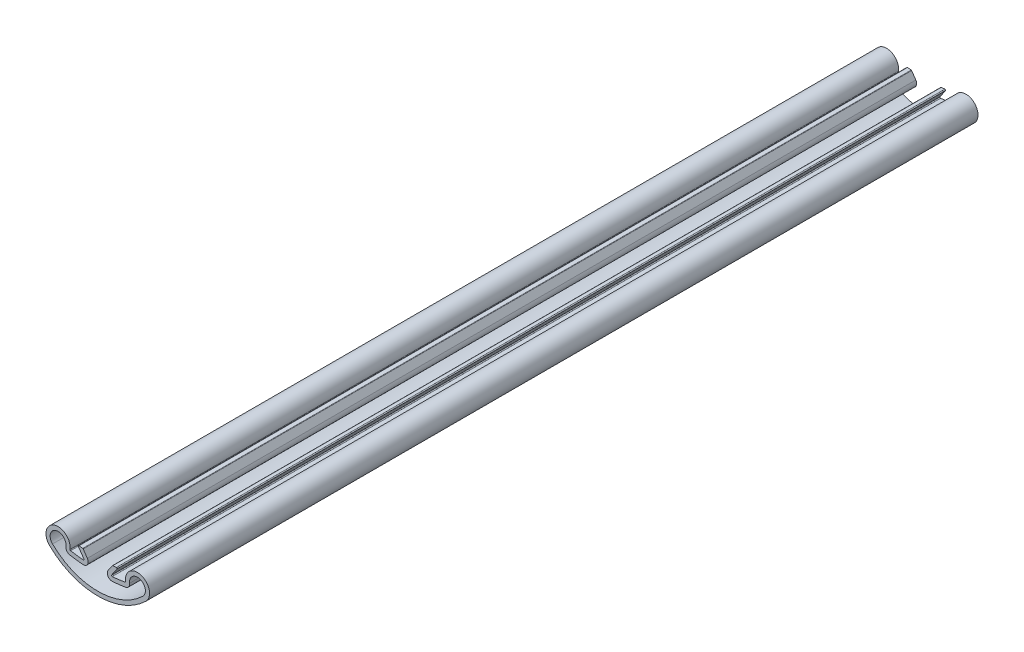
ISO-10303-21;
HEADER;
FILE_DESCRIPTION(('STEP AP214'),'2;1');
FILE_NAME('part.step','',(''),(''),'','','');
FILE_SCHEMA(('AUTOMOTIVE_DESIGN { 1 0 10303 214 1 1 1 1 }'));
ENDSEC;
DATA;
#1=APPLICATION_CONTEXT('core data for automotive mechanical design processes');
#2=APPLICATION_PROTOCOL_DEFINITION('international standard','automotive_design',2000,#1);
#3=PRODUCT_CONTEXT('',#1,'mechanical');
#4=PRODUCT('Part','Part','',(#3));
#5=PRODUCT_RELATED_PRODUCT_CATEGORY('part','',(#4));
#6=PRODUCT_DEFINITION_FORMATION('','',#4);
#7=PRODUCT_DEFINITION_CONTEXT('part definition',#1,'design');
#8=PRODUCT_DEFINITION('design','',#6,#7);
#9=PRODUCT_DEFINITION_SHAPE('','',#8);
#10=(LENGTH_UNIT() NAMED_UNIT(*) SI_UNIT(.MILLI.,.METRE.));
#11=(NAMED_UNIT(*) PLANE_ANGLE_UNIT() SI_UNIT($,.RADIAN.));
#12=(NAMED_UNIT(*) SI_UNIT($,.STERADIAN.) SOLID_ANGLE_UNIT());
#13=UNCERTAINTY_MEASURE_WITH_UNIT(LENGTH_MEASURE(1.E-05),#10,'distance_accuracy_value','');
#14=(GEOMETRIC_REPRESENTATION_CONTEXT(3) GLOBAL_UNCERTAINTY_ASSIGNED_CONTEXT((#13)) GLOBAL_UNIT_ASSIGNED_CONTEXT((#10,
#11,#12)) REPRESENTATION_CONTEXT('',''));
#15=CARTESIAN_POINT('',(0.,0.,0.));
#16=DIRECTION('',(0.,0.,1.));
#17=DIRECTION('',(1.,0.,0.));
#18=AXIS2_PLACEMENT_3D('',#15,#16,#17);
#19=CARTESIAN_POINT('',(7.84000007275032,-47.6594628469444,-272.189105305812));
#20=DIRECTION('',(0.,0.,1.));
#21=DIRECTION('',(1.,0.,0.));
#22=AXIS2_PLACEMENT_3D('',#19,#20,#21);
#23=CYLINDRICAL_SURFACE('',#22,0.199999999999998);
#24=CARTESIAN_POINT('',(7.84000007275032,-47.6594628469444,-240.));
#25=DIRECTION('',(0.,0.,1.));
#26=DIRECTION('',(1.,0.,0.));
#27=AXIS2_PLACEMENT_3D('',#24,#25,#26);
#28=CIRCLE('',#27,0.199999999999998);
#29=CARTESIAN_POINT('',(7.8724638411675,-47.8568105191885,-240.));
#30=VERTEX_POINT('',#29);
#31=CARTESIAN_POINT('',(8.0378379066557,-47.6301338258965,-240.));
#32=VERTEX_POINT('',#31);
#33=EDGE_CURVE('E41',#30,#32,#28,.T.);
#34=ORIENTED_EDGE('',*,*,#33,.F.);
#35=DIRECTION('',(0.,0.,1.));
#36=VECTOR('',#35,1.);
#37=CARTESIAN_POINT('',(7.8724638411675,-47.8568105191885,-272.189105305812));
#38=LINE('',#37,#36);
#39=CARTESIAN_POINT('',(7.8724638411675,-47.8568105191885,0.));
#40=VERTEX_POINT('',#39);
#41=EDGE_CURVE('E216',#30,#40,#38,.T.);
#42=ORIENTED_EDGE('',*,*,#41,.T.);
#43=CARTESIAN_POINT('',(7.84000007275032,-47.6594628469444,0.));
#44=DIRECTION('',(0.,0.,-1.));
#45=DIRECTION('',(1.,0.,0.));
#46=AXIS2_PLACEMENT_3D('',#43,#44,#45);
#47=CIRCLE('',#46,0.199999999999998);
#48=CARTESIAN_POINT('',(8.0378379066557,-47.6301338258965,0.));
#49=VERTEX_POINT('',#48);
#50=EDGE_CURVE('E220',#49,#40,#47,.T.);
#51=ORIENTED_EDGE('',*,*,#50,.F.);
#52=DIRECTION('',(0.,0.,1.));
#53=VECTOR('',#52,1.);
#54=CARTESIAN_POINT('',(8.0378379066557,-47.6301338258965,-272.189105305812));
#55=LINE('',#54,#53);
#56=EDGE_CURVE('E315',#32,#49,#55,.T.);
#57=ORIENTED_EDGE('',*,*,#56,.F.);
#58=EDGE_LOOP('',(#34,#42,#51,#57));
#59=FACE_BOUND('',#58,.T.);
#60=ADVANCED_FACE('F34',(#59),#23,.F.);
#61=CARTESIAN_POINT('',(11.4999999999999,-47.116875957559,-272.189105305812));
#62=DIRECTION('',(0.,0.,1.));
#63=DIRECTION('',(1.,0.,0.));
#64=AXIS2_PLACEMENT_3D('',#61,#62,#63);
#65=CYLINDRICAL_SURFACE('',#64,3.5);
#66=CARTESIAN_POINT('',(11.4999999999999,-47.116875957559,-240.));
#67=DIRECTION('',(0.,0.,1.));
#68=DIRECTION('',(1.,0.,0.));
#69=AXIS2_PLACEMENT_3D('',#66,#67,#68);
#70=CIRCLE('',#69,3.5);
#71=CARTESIAN_POINT('',(13.9393939393939,-49.6267279867528,-240.));
#72=VERTEX_POINT('',#71);
#73=EDGE_CURVE('E507',#32,#72,#70,.F.);
#74=ORIENTED_EDGE('',*,*,#73,.F.);
#75=ORIENTED_EDGE('',*,*,#56,.T.);
#76=CARTESIAN_POINT('',(11.4999999999999,-47.116875957559,0.));
#77=DIRECTION('',(0.,0.,1.));
#78=DIRECTION('',(1.,0.,0.));
#79=AXIS2_PLACEMENT_3D('',#76,#77,#78);
#80=CIRCLE('',#79,3.5);
#81=CARTESIAN_POINT('',(13.9393939393939,-49.6267279867528,0.));
#82=VERTEX_POINT('',#81);
#83=EDGE_CURVE('E225',#82,#49,#80,.T.);
#84=ORIENTED_EDGE('',*,*,#83,.F.);
#85=DIRECTION('',(0.,0.,1.));
#86=VECTOR('',#85,1.);
#87=CARTESIAN_POINT('',(13.9393939393939,-49.6267279867528,-272.189105305812));
#88=LINE('',#87,#86);
#89=EDGE_CURVE('E318',#72,#82,#88,.T.);
#90=ORIENTED_EDGE('',*,*,#89,.F.);
#91=EDGE_LOOP('',(#74,#75,#84,#90));
#92=FACE_BOUND('',#91,.T.);
#93=ADVANCED_FACE('F506',(#92),#65,.T.);
#94=CARTESIAN_POINT('',(0.,-35.2847163913598,-272.189105305812));
#95=DIRECTION('',(0.,0.,1.));
#96=DIRECTION('',(1.,0.,0.));
#97=AXIS2_PLACEMENT_3D('',#94,#95,#96);
#98=CYLINDRICAL_SURFACE('',#97,20.);
#99=CARTESIAN_POINT('',(0.,-35.2847163913598,-240.));
#100=DIRECTION('',(0.,0.,1.));
#101=DIRECTION('',(1.,0.,0.));
#102=AXIS2_PLACEMENT_3D('',#99,#100,#101);
#103=CIRCLE('',#102,20.);
#104=CARTESIAN_POINT('',(-13.939393939394,-49.6267279867528,-240.));
#105=VERTEX_POINT('',#104);
#106=EDGE_CURVE('E503',#72,#105,#103,.F.);
#107=ORIENTED_EDGE('',*,*,#106,.F.);
#108=ORIENTED_EDGE('',*,*,#89,.T.);
#109=CARTESIAN_POINT('',(0.,-35.2847163913598,0.));
#110=DIRECTION('',(0.,0.,1.));
#111=DIRECTION('',(1.,0.,0.));
#112=AXIS2_PLACEMENT_3D('',#109,#110,#111);
#113=CIRCLE('',#112,20.);
#114=CARTESIAN_POINT('',(-13.939393939394,-49.6267279867528,0.));
#115=VERTEX_POINT('',#114);
#116=EDGE_CURVE('E312',#115,#82,#113,.T.);
#117=ORIENTED_EDGE('',*,*,#116,.F.);
#118=DIRECTION('',(0.,0.,1.));
#119=VECTOR('',#118,1.);
#120=CARTESIAN_POINT('',(-13.939393939394,-49.6267279867528,-272.189105305812));
#121=LINE('',#120,#119);
#122=EDGE_CURVE('E320',#105,#115,#121,.T.);
#123=ORIENTED_EDGE('',*,*,#122,.F.);
#124=EDGE_LOOP('',(#107,#108,#117,#123));
#125=FACE_BOUND('',#124,.T.);
#126=ADVANCED_FACE('F501',(#125),#98,.T.);
#127=CARTESIAN_POINT('',(-11.5000000000001,-47.116875957559,-272.189105305812));
#128=DIRECTION('',(0.,0.,1.));
#129=DIRECTION('',(1.,0.,0.));
#130=AXIS2_PLACEMENT_3D('',#127,#128,#129);
#131=CYLINDRICAL_SURFACE('',#130,3.50000000000003);
#132=CARTESIAN_POINT('',(-11.5000000000001,-47.116875957559,-240.));
#133=DIRECTION('',(0.,0.,1.));
#134=DIRECTION('',(1.,0.,0.));
#135=AXIS2_PLACEMENT_3D('',#132,#133,#134);
#136=CIRCLE('',#135,3.50000000000003);
#137=CARTESIAN_POINT('',(-8.03783790665579,-47.6301338258965,-240.));
#138=VERTEX_POINT('',#137);
#139=EDGE_CURVE('E498',#105,#138,#136,.F.);
#140=ORIENTED_EDGE('',*,*,#139,.F.);
#141=ORIENTED_EDGE('',*,*,#122,.T.);
#142=CARTESIAN_POINT('',(-11.5000000000001,-47.116875957559,0.));
#143=DIRECTION('',(0.,0.,1.));
#144=DIRECTION('',(1.,0.,0.));
#145=AXIS2_PLACEMENT_3D('',#142,#143,#144);
#146=CIRCLE('',#145,3.50000000000003);
#147=CARTESIAN_POINT('',(-8.03783790665579,-47.6301338258965,0.));
#148=VERTEX_POINT('',#147);
#149=EDGE_CURVE('E309',#148,#115,#146,.T.);
#150=ORIENTED_EDGE('',*,*,#149,.F.);
#151=DIRECTION('',(0.,0.,1.));
#152=VECTOR('',#151,1.);
#153=CARTESIAN_POINT('',(-8.03783790665579,-47.6301338258965,-272.189105305812));
#154=LINE('',#153,#152);
#155=EDGE_CURVE('E322',#138,#148,#154,.T.);
#156=ORIENTED_EDGE('',*,*,#155,.F.);
#157=EDGE_LOOP('',(#140,#141,#150,#156));
#158=FACE_BOUND('',#157,.T.);
#159=ADVANCED_FACE('F496',(#158),#131,.T.);
#160=CARTESIAN_POINT('',(-7.84000007275041,-47.6594628469444,-272.189105305812));
#161=DIRECTION('',(0.,0.,1.));
#162=DIRECTION('',(1.,0.,0.));
#163=AXIS2_PLACEMENT_3D('',#160,#161,#162);
#164=CYLINDRICAL_SURFACE('',#163,0.199999999999998);
#165=CARTESIAN_POINT('',(-7.84000007275041,-47.6594628469444,-240.));
#166=DIRECTION('',(0.,0.,1.));
#167=DIRECTION('',(1.,0.,0.));
#168=AXIS2_PLACEMENT_3D('',#165,#166,#167);
#169=CIRCLE('',#168,0.199999999999998);
#170=CARTESIAN_POINT('',(-7.8724638411676,-47.8568105191885,-240.));
#171=VERTEX_POINT('',#170);
#172=EDGE_CURVE('E511',#138,#171,#169,.T.);
#173=ORIENTED_EDGE('',*,*,#172,.F.);
#174=ORIENTED_EDGE('',*,*,#155,.T.);
#175=CARTESIAN_POINT('',(-7.84000007275041,-47.6594628469444,0.));
#176=DIRECTION('',(0.,0.,-1.));
#177=DIRECTION('',(1.,0.,0.));
#178=AXIS2_PLACEMENT_3D('',#175,#176,#177);
#179=CIRCLE('',#178,0.199999999999998);
#180=CARTESIAN_POINT('',(-7.8724638411676,-47.8568105191885,0.));
#181=VERTEX_POINT('',#180);
#182=EDGE_CURVE('E306',#181,#148,#179,.T.);
#183=ORIENTED_EDGE('',*,*,#182,.F.);
#184=DIRECTION('',(0.,0.,1.));
#185=VECTOR('',#184,1.);
#186=CARTESIAN_POINT('',(-7.8724638411676,-47.8568105191885,-272.189105305812));
#187=LINE('',#186,#185);
#188=EDGE_CURVE('E324',#171,#181,#187,.T.);
#189=ORIENTED_EDGE('',*,*,#188,.F.);
#190=EDGE_LOOP('',(#173,#174,#183,#189));
#191=FACE_BOUND('',#190,.T.);
#192=ADVANCED_FACE('F490',(#191),#164,.F.);
#193=CARTESIAN_POINT('',(0.,0.,-272.189105305812));
#194=DIRECTION('',(0.,0.,1.));
#195=DIRECTION('',(1.,0.,0.));
#196=AXIS2_PLACEMENT_3D('',#193,#194,#195);
#197=CYLINDRICAL_SURFACE('',#196,48.5);
#198=CARTESIAN_POINT('',(0.,0.,-240.));
#199=DIRECTION('',(0.,0.,1.));
#200=DIRECTION('',(1.,0.,0.));
#201=AXIS2_PLACEMENT_3D('',#198,#199,#200);
#202=CIRCLE('',#201,48.5);
#203=CARTESIAN_POINT('',(-4.18752806437922,-48.3188845971224,-240.));
#204=VERTEX_POINT('',#203);
#205=EDGE_CURVE('E487',#171,#204,#202,.T.);
#206=ORIENTED_EDGE('',*,*,#205,.F.);
#207=ORIENTED_EDGE('',*,*,#188,.T.);
#208=CARTESIAN_POINT('',(0.,0.,0.));
#209=DIRECTION('',(0.,0.,-1.));
#210=DIRECTION('',(1.,0.,0.));
#211=AXIS2_PLACEMENT_3D('',#208,#209,#210);
#212=CIRCLE('',#211,48.5);
#213=CARTESIAN_POINT('',(-4.18752806437922,-48.3188845971224,0.));
#214=VERTEX_POINT('',#213);
#215=EDGE_CURVE('E303',#214,#181,#212,.T.);
#216=ORIENTED_EDGE('',*,*,#215,.F.);
#217=DIRECTION('',(0.,0.,1.));
#218=VECTOR('',#217,1.);
#219=CARTESIAN_POINT('',(-4.18752806437922,-48.3188845971224,-272.189105305812));
#220=LINE('',#219,#218);
#221=EDGE_CURVE('E326',#204,#214,#220,.T.);
#222=ORIENTED_EDGE('',*,*,#221,.F.);
#223=EDGE_LOOP('',(#206,#207,#216,#222));
#224=FACE_BOUND('',#223,.T.);
#225=ADVANCED_FACE('F484',(#224),#197,.F.);
#226=CARTESIAN_POINT('',(-4.17025990741271,-48.1196314647632,-272.189105305812));
#227=DIRECTION('',(0.,0.,1.));
#228=DIRECTION('',(1.,0.,0.));
#229=AXIS2_PLACEMENT_3D('',#226,#227,#228);
#230=CYLINDRICAL_SURFACE('',#229,0.200000000000004);
#231=CARTESIAN_POINT('',(-4.17025990741271,-48.1196314647632,-240.));
#232=DIRECTION('',(0.,0.,1.));
#233=DIRECTION('',(1.,0.,0.));
#234=AXIS2_PLACEMENT_3D('',#231,#232,#233);
#235=CIRCLE('',#234,0.200000000000004);
#236=CARTESIAN_POINT('',(-4.00540591569954,-48.0063920660707,-240.));
#237=VERTEX_POINT('',#236);
#238=EDGE_CURVE('E481',#204,#237,#235,.T.);
#239=ORIENTED_EDGE('',*,*,#238,.F.);
#240=ORIENTED_EDGE('',*,*,#221,.T.);
#241=CARTESIAN_POINT('',(-4.17025990741271,-48.1196314647632,0.));
#242=DIRECTION('',(0.,0.,-1.));
#243=DIRECTION('',(-1.,0.,0.));
#244=AXIS2_PLACEMENT_3D('',#241,#242,#243);
#245=CIRCLE('',#244,0.200000000000004);
#246=CARTESIAN_POINT('',(-4.00540591569954,-48.0063920660707,0.));
#247=VERTEX_POINT('',#246);
#248=EDGE_CURVE('E300',#247,#214,#245,.T.);
#249=ORIENTED_EDGE('',*,*,#248,.F.);
#250=DIRECTION('',(0.,0.,1.));
#251=VECTOR('',#250,1.);
#252=CARTESIAN_POINT('',(-4.00540591569954,-48.0063920660707,-272.189105305812));
#253=LINE('',#252,#251);
#254=EDGE_CURVE('E328',#237,#247,#253,.T.);
#255=ORIENTED_EDGE('',*,*,#254,.F.);
#256=EDGE_LOOP('',(#239,#240,#249,#255));
#257=FACE_BOUND('',#256,.T.);
#258=ADVANCED_FACE('F479',(#257),#230,.F.);
#259=CARTESIAN_POINT('',(-4.00540591569954,-48.0063920660707,-272.189105305812));
#260=DIRECTION('',(-0.824269958565817,-0.56619699346244,0.));
#261=DIRECTION('',(0.56619699346244,-0.824269958565817,0.));
#262=AXIS2_PLACEMENT_3D('',#259,#260,#261);
#263=PLANE('',#262);
#264=DIRECTION('',(-0.56619699346244,0.824269958565817,0.));
#265=VECTOR('',#264,1.);
#266=CARTESIAN_POINT('',(-4.00540591569954,-48.0063920660707,-240.));
#267=LINE('',#266,#265);
#268=CARTESIAN_POINT('',(-5.59601440408828,-45.6907831738352,-240.));
#269=VERTEX_POINT('',#268);
#270=EDGE_CURVE('E515',#237,#269,#267,.T.);
#271=ORIENTED_EDGE('',*,*,#270,.F.);
#272=ORIENTED_EDGE('',*,*,#254,.T.);
#273=DIRECTION('',(0.56619699346244,-0.824269958565817,0.));
#274=VECTOR('',#273,1.);
#275=CARTESIAN_POINT('',(-4.00540591569954,-48.0063920660707,0.));
#276=LINE('',#275,#274);
#277=CARTESIAN_POINT('',(-5.59601440408828,-45.6907831738352,0.));
#278=VERTEX_POINT('',#277);
#279=EDGE_CURVE('E297',#278,#247,#276,.T.);
#280=ORIENTED_EDGE('',*,*,#279,.F.);
#281=DIRECTION('',(0.,0.,1.));
#282=VECTOR('',#281,1.);
#283=CARTESIAN_POINT('',(-5.59601440408828,-45.6907831738352,-272.189105305812));
#284=LINE('',#283,#282);
#285=EDGE_CURVE('E330',#269,#278,#284,.T.);
#286=ORIENTED_EDGE('',*,*,#285,.F.);
#287=EDGE_LOOP('',(#271,#272,#280,#286));
#288=FACE_BOUND('',#287,.T.);
#289=ADVANCED_FACE('F473',(#288),#263,.T.);
#290=CARTESIAN_POINT('',(-5.43116041237512,-45.5775437751427,-272.189105305812));
#291=DIRECTION('',(0.,0.,1.));
#292=DIRECTION('',(1.,0.,0.));
#293=AXIS2_PLACEMENT_3D('',#290,#291,#292);
#294=CYLINDRICAL_SURFACE('',#293,0.199999999999996);
#295=CARTESIAN_POINT('',(-5.43116041237512,-45.5775437751427,-240.));
#296=DIRECTION('',(0.,0.,1.));
#297=DIRECTION('',(1.,0.,0.));
#298=AXIS2_PLACEMENT_3D('',#295,#296,#297);
#299=CIRCLE('',#298,0.199999999999996);
#300=CARTESIAN_POINT('',(-5.40749522539309,-45.3789488131595,-240.));
#301=VERTEX_POINT('',#300);
#302=EDGE_CURVE('E470',#269,#301,#299,.F.);
#303=ORIENTED_EDGE('',*,*,#302,.F.);
#304=ORIENTED_EDGE('',*,*,#285,.T.);
#305=CARTESIAN_POINT('',(-5.43116041237512,-45.5775437751427,0.));
#306=DIRECTION('',(0.,0.,1.));
#307=DIRECTION('',(1.,0.,0.));
#308=AXIS2_PLACEMENT_3D('',#305,#306,#307);
#309=CIRCLE('',#308,0.199999999999996);
#310=CARTESIAN_POINT('',(-5.40749522539309,-45.3789488131595,0.));
#311=VERTEX_POINT('',#310);
#312=EDGE_CURVE('E294',#311,#278,#309,.T.);
#313=ORIENTED_EDGE('',*,*,#312,.F.);
#314=DIRECTION('',(0.,0.,1.));
#315=VECTOR('',#314,1.);
#316=CARTESIAN_POINT('',(-5.40749522539309,-45.3789488131595,-272.189105305812));
#317=LINE('',#316,#315);
#318=EDGE_CURVE('E332',#301,#311,#317,.T.);
#319=ORIENTED_EDGE('',*,*,#318,.F.);
#320=EDGE_LOOP('',(#303,#304,#313,#319));
#321=FACE_BOUND('',#320,.T.);
#322=ADVANCED_FACE('F467',(#321),#294,.T.);
#323=CARTESIAN_POINT('',(0.,0.,-272.189105305812));
#324=DIRECTION('',(0.,0.,1.));
#325=DIRECTION('',(1.,0.,0.));
#326=AXIS2_PLACEMENT_3D('',#323,#324,#325);
#327=CYLINDRICAL_SURFACE('',#326,45.7);
#328=CARTESIAN_POINT('',(0.,0.,-240.));
#329=DIRECTION('',(0.,0.,1.));
#330=DIRECTION('',(1.,0.,0.));
#331=AXIS2_PLACEMENT_3D('',#328,#329,#330);
#332=CIRCLE('',#331,45.7);
#333=CARTESIAN_POINT('',(-4.3640971528148,-45.491149205541,-240.));
#334=VERTEX_POINT('',#333);
#335=EDGE_CURVE('E464',#301,#334,#332,.T.);
#336=ORIENTED_EDGE('',*,*,#335,.F.);
#337=ORIENTED_EDGE('',*,*,#318,.T.);
#338=CARTESIAN_POINT('',(0.,0.,0.));
#339=DIRECTION('',(0.,0.,-1.));
#340=DIRECTION('',(1.,0.,0.));
#341=AXIS2_PLACEMENT_3D('',#338,#339,#340);
#342=CIRCLE('',#341,45.7);
#343=CARTESIAN_POINT('',(-4.3640971528148,-45.491149205541,0.));
#344=VERTEX_POINT('',#343);
#345=EDGE_CURVE('E291',#344,#311,#342,.T.);
#346=ORIENTED_EDGE('',*,*,#345,.F.);
#347=DIRECTION('',(0.,0.,1.));
#348=VECTOR('',#347,1.);
#349=CARTESIAN_POINT('',(-4.3640971528148,-45.491149205541,-272.189105305812));
#350=LINE('',#349,#348);
#351=EDGE_CURVE('E334',#334,#344,#350,.T.);
#352=ORIENTED_EDGE('',*,*,#351,.F.);
#353=EDGE_LOOP('',(#336,#337,#346,#352));
#354=FACE_BOUND('',#353,.T.);
#355=ADVANCED_FACE('F462',(#354),#327,.F.);
#356=CARTESIAN_POINT('',(-4.38319604626257,-45.6902351976878,-272.189105305812));
#357=DIRECTION('',(0.,0.,1.));
#358=DIRECTION('',(1.,0.,0.));
#359=AXIS2_PLACEMENT_3D('',#356,#357,#358);
#360=CYLINDRICAL_SURFACE('',#359,0.199999999999994);
#361=CARTESIAN_POINT('',(-4.38319604626257,-45.6902351976878,-240.));
#362=DIRECTION('',(0.,0.,1.));
#363=DIRECTION('',(1.,0.,0.));
#364=AXIS2_PLACEMENT_3D('',#361,#362,#363);
#365=CIRCLE('',#364,0.199999999999994);
#366=CARTESIAN_POINT('',(-4.21834205454941,-45.5769957989953,-240.));
#367=VERTEX_POINT('',#366);
#368=EDGE_CURVE('E519',#334,#367,#365,.F.);
#369=ORIENTED_EDGE('',*,*,#368,.F.);
#370=ORIENTED_EDGE('',*,*,#351,.T.);
#371=CARTESIAN_POINT('',(-4.38319604626257,-45.6902351976878,0.));
#372=DIRECTION('',(0.,0.,1.));
#373=DIRECTION('',(1.,0.,0.));
#374=AXIS2_PLACEMENT_3D('',#371,#372,#373);
#375=CIRCLE('',#374,0.199999999999994);
#376=CARTESIAN_POINT('',(-4.21834205454941,-45.5769957989953,0.));
#377=VERTEX_POINT('',#376);
#378=EDGE_CURVE('E288',#377,#344,#375,.T.);
#379=ORIENTED_EDGE('',*,*,#378,.F.);
#380=DIRECTION('',(0.,0.,1.));
#381=VECTOR('',#380,1.);
#382=CARTESIAN_POINT('',(-4.21834205454941,-45.5769957989953,-272.189105305812));
#383=LINE('',#382,#381);
#384=EDGE_CURVE('E336',#367,#377,#383,.T.);
#385=ORIENTED_EDGE('',*,*,#384,.F.);
#386=EDGE_LOOP('',(#369,#370,#379,#385));
#387=FACE_BOUND('',#386,.T.);
#388=ADVANCED_FACE('F456',(#387),#360,.T.);
#389=CARTESIAN_POINT('',(-3.01628196542057,-47.3269556739158,-272.189105305812));
#390=DIRECTION('',(0.824269958565818,0.566196993462439,0.));
#391=DIRECTION('',(-0.566196993462439,0.824269958565818,0.));
#392=AXIS2_PLACEMENT_3D('',#389,#390,#391);
#393=PLANE('',#392);
#394=DIRECTION('',(0.566196993462439,-0.824269958565818,0.));
#395=VECTOR('',#394,1.);
#396=CARTESIAN_POINT('',(-3.01628196542057,-47.3269556739158,-240.));
#397=LINE('',#396,#395);
#398=CARTESIAN_POINT('',(-3.01628196542057,-47.3269556739158,-240.));
#399=VERTEX_POINT('',#398);
#400=EDGE_CURVE('E453',#367,#399,#397,.T.);
#401=ORIENTED_EDGE('',*,*,#400,.F.);
#402=ORIENTED_EDGE('',*,*,#384,.T.);
#403=DIRECTION('',(-0.566196993462439,0.824269958565818,0.));
#404=VECTOR('',#403,1.);
#405=CARTESIAN_POINT('',(-3.01628196542057,-47.3269556739158,0.));
#406=LINE('',#405,#404);
#407=CARTESIAN_POINT('',(-3.01628196542057,-47.3269556739158,0.));
#408=VERTEX_POINT('',#407);
#409=EDGE_CURVE('E285',#408,#377,#406,.T.);
#410=ORIENTED_EDGE('',*,*,#409,.F.);
#411=DIRECTION('',(0.,0.,1.));
#412=VECTOR('',#411,1.);
#413=CARTESIAN_POINT('',(-3.01628196542057,-47.3269556739158,-272.189105305812));
#414=LINE('',#413,#412);
#415=EDGE_CURVE('E338',#399,#408,#414,.T.);
#416=ORIENTED_EDGE('',*,*,#415,.F.);
#417=EDGE_LOOP('',(#401,#402,#410,#416));
#418=FACE_BOUND('',#417,.T.);
#419=ADVANCED_FACE('F450',(#418),#393,.T.);
#420=CARTESIAN_POINT('',(-4.17025990741271,-48.1196314647632,-272.189105305812));
#421=DIRECTION('',(0.,0.,1.));
#422=DIRECTION('',(1.,0.,0.));
#423=AXIS2_PLACEMENT_3D('',#420,#421,#422);
#424=CYLINDRICAL_SURFACE('',#423,1.4);
#425=CARTESIAN_POINT('',(-4.17025990741271,-48.1196314647632,-240.));
#426=DIRECTION('',(0.,0.,1.));
#427=DIRECTION('',(1.,0.,0.));
#428=AXIS2_PLACEMENT_3D('',#425,#426,#427);
#429=CIRCLE('',#428,1.4);
#430=CARTESIAN_POINT('',(-4.29113700617831,-49.514403391278,-240.));
#431=VERTEX_POINT('',#430);
#432=EDGE_CURVE('E447',#399,#431,#429,.F.);
#433=ORIENTED_EDGE('',*,*,#432,.F.);
#434=ORIENTED_EDGE('',*,*,#415,.T.);
#435=CARTESIAN_POINT('',(-4.17025990741271,-48.1196314647632,0.));
#436=DIRECTION('',(0.,0.,1.));
#437=DIRECTION('',(-1.,0.,0.));
#438=AXIS2_PLACEMENT_3D('',#435,#436,#437);
#439=CIRCLE('',#438,1.4);
#440=CARTESIAN_POINT('',(-4.29113700617832,-49.514403391278,0.));
#441=VERTEX_POINT('',#440);
#442=EDGE_CURVE('E282',#441,#408,#439,.T.);
#443=ORIENTED_EDGE('',*,*,#442,.F.);
#444=DIRECTION('',(0.,0.,1.));
#445=VECTOR('',#444,1.);
#446=CARTESIAN_POINT('',(-4.29113700617832,-49.514403391278,-272.189105305812));
#447=LINE('',#446,#445);
#448=EDGE_CURVE('E340',#431,#441,#447,.T.);
#449=ORIENTED_EDGE('',*,*,#448,.F.);
#450=EDGE_LOOP('',(#433,#434,#443,#449));
#451=FACE_BOUND('',#450,.T.);
#452=ADVANCED_FACE('F445',(#451),#424,.T.);
#453=CARTESIAN_POINT('',(0.,0.,-272.189105305812));
#454=DIRECTION('',(0.,0.,1.));
#455=DIRECTION('',(1.,0.,0.));
#456=AXIS2_PLACEMENT_3D('',#453,#454,#455);
#457=CYLINDRICAL_SURFACE('',#456,49.7);
#458=CARTESIAN_POINT('',(0.,0.,-240.));
#459=DIRECTION('',(0.,0.,1.));
#460=DIRECTION('',(1.,0.,0.));
#461=AXIS2_PLACEMENT_3D('',#458,#459,#460);
#462=CIRCLE('',#461,49.7);
#463=CARTESIAN_POINT('',(-8.06724645167072,-49.0408965526529,-240.));
#464=VERTEX_POINT('',#463);
#465=EDGE_CURVE('E523',#431,#464,#462,.F.);
#466=ORIENTED_EDGE('',*,*,#465,.F.);
#467=ORIENTED_EDGE('',*,*,#448,.T.);
#468=CARTESIAN_POINT('',(0.,0.,0.));
#469=DIRECTION('',(0.,0.,1.));
#470=DIRECTION('',(1.,0.,0.));
#471=AXIS2_PLACEMENT_3D('',#468,#469,#470);
#472=CIRCLE('',#471,49.7);
#473=CARTESIAN_POINT('',(-8.06724645167072,-49.0408965526529,0.));
#474=VERTEX_POINT('',#473);
#475=EDGE_CURVE('E279',#474,#441,#472,.T.);
#476=ORIENTED_EDGE('',*,*,#475,.F.);
#477=DIRECTION('',(0.,0.,1.));
#478=VECTOR('',#477,1.);
#479=CARTESIAN_POINT('',(-8.06724645167072,-49.0408965526529,-272.189105305812));
#480=LINE('',#479,#478);
#481=EDGE_CURVE('E342',#464,#474,#480,.T.);
#482=ORIENTED_EDGE('',*,*,#481,.F.);
#483=EDGE_LOOP('',(#466,#467,#476,#482));
#484=FACE_BOUND('',#483,.T.);
#485=ADVANCED_FACE('F439',(#484),#457,.T.);
#486=CARTESIAN_POINT('',(-7.84000007275047,-47.6594628469444,-272.189105305812));
#487=DIRECTION('',(0.,0.,1.));
#488=DIRECTION('',(1.,0.,0.));
#489=AXIS2_PLACEMENT_3D('',#486,#487,#488);
#490=CYLINDRICAL_SURFACE('',#489,1.4);
#491=CARTESIAN_POINT('',(-7.84000007275047,-47.6594628469444,-240.));
#492=DIRECTION('',(0.,0.,1.));
#493=DIRECTION('',(1.,0.,0.));
#494=AXIS2_PLACEMENT_3D('',#491,#492,#493);
#495=CIRCLE('',#494,1.4);
#496=CARTESIAN_POINT('',(-9.22486491008815,-47.4541596996094,-240.));
#497=VERTEX_POINT('',#496);
#498=EDGE_CURVE('E436',#464,#497,#495,.F.);
#499=ORIENTED_EDGE('',*,*,#498,.F.);
#500=ORIENTED_EDGE('',*,*,#481,.T.);
#501=CARTESIAN_POINT('',(-7.84000007275047,-47.6594628469444,0.));
#502=DIRECTION('',(0.,0.,1.));
#503=DIRECTION('',(1.,0.,0.));
#504=AXIS2_PLACEMENT_3D('',#501,#502,#503);
#505=CIRCLE('',#504,1.4);
#506=CARTESIAN_POINT('',(-9.22486491008815,-47.4541596996094,0.));
#507=VERTEX_POINT('',#506);
#508=EDGE_CURVE('E276',#507,#474,#505,.T.);
#509=ORIENTED_EDGE('',*,*,#508,.F.);
#510=DIRECTION('',(0.,0.,1.));
#511=VECTOR('',#510,1.);
#512=CARTESIAN_POINT('',(-9.22486491008815,-47.4541596996094,-272.189105305812));
#513=LINE('',#512,#511);
#514=EDGE_CURVE('E344',#497,#507,#513,.T.);
#515=ORIENTED_EDGE('',*,*,#514,.F.);
#516=EDGE_LOOP('',(#499,#500,#509,#515));
#517=FACE_BOUND('',#516,.T.);
#518=ADVANCED_FACE('F433',(#517),#490,.T.);
#519=CARTESIAN_POINT('',(-11.5000000000001,-47.116875957559,-272.189105305812));
#520=DIRECTION('',(0.,0.,1.));
#521=DIRECTION('',(1.,0.,0.));
#522=AXIS2_PLACEMENT_3D('',#519,#520,#521);
#523=CYLINDRICAL_SURFACE('',#522,2.3);
#524=CARTESIAN_POINT('',(-11.5000000000001,-47.116875957559,-240.));
#525=DIRECTION('',(0.,0.,1.));
#526=DIRECTION('',(1.,0.,0.));
#527=AXIS2_PLACEMENT_3D('',#524,#525,#526);
#528=CIRCLE('',#527,2.3);
#529=CARTESIAN_POINT('',(-13.1030303030304,-48.7662072910292,-240.));
#530=VERTEX_POINT('',#529);
#531=EDGE_CURVE('E430',#497,#530,#528,.T.);
#532=ORIENTED_EDGE('',*,*,#531,.F.);
#533=ORIENTED_EDGE('',*,*,#514,.T.);
#534=CARTESIAN_POINT('',(-11.5000000000001,-47.116875957559,0.));
#535=DIRECTION('',(0.,0.,-1.));
#536=DIRECTION('',(1.,0.,0.));
#537=AXIS2_PLACEMENT_3D('',#534,#535,#536);
#538=CIRCLE('',#537,2.3);
#539=CARTESIAN_POINT('',(-13.1030303030304,-48.7662072910292,0.));
#540=VERTEX_POINT('',#539);
#541=EDGE_CURVE('E273',#540,#507,#538,.T.);
#542=ORIENTED_EDGE('',*,*,#541,.F.);
#543=DIRECTION('',(0.,0.,1.));
#544=VECTOR('',#543,1.);
#545=CARTESIAN_POINT('',(-13.1030303030304,-48.7662072910292,-272.189105305812));
#546=LINE('',#545,#544);
#547=EDGE_CURVE('E346',#530,#540,#546,.T.);
#548=ORIENTED_EDGE('',*,*,#547,.F.);
#549=EDGE_LOOP('',(#532,#533,#542,#548));
#550=FACE_BOUND('',#549,.T.);
#551=ADVANCED_FACE('F428',(#550),#523,.F.);
#552=CARTESIAN_POINT('',(0.,-35.2847163913598,-272.189105305812));
#553=DIRECTION('',(0.,0.,1.));
#554=DIRECTION('',(1.,0.,0.));
#555=AXIS2_PLACEMENT_3D('',#552,#553,#554);
#556=CYLINDRICAL_SURFACE('',#555,18.8);
#557=CARTESIAN_POINT('',(0.,-35.2847163913598,-240.));
#558=DIRECTION('',(0.,0.,1.));
#559=DIRECTION('',(1.,0.,0.));
#560=AXIS2_PLACEMENT_3D('',#557,#558,#559);
#561=CIRCLE('',#560,18.8);
#562=CARTESIAN_POINT('',(13.1030303030302,-48.7662072910292,-240.));
#563=VERTEX_POINT('',#562);
#564=EDGE_CURVE('E527',#530,#563,#561,.T.);
#565=ORIENTED_EDGE('',*,*,#564,.F.);
#566=ORIENTED_EDGE('',*,*,#547,.T.);
#567=CARTESIAN_POINT('',(0.,-35.2847163913598,0.));
#568=DIRECTION('',(0.,0.,-1.));
#569=DIRECTION('',(1.,0.,0.));
#570=AXIS2_PLACEMENT_3D('',#567,#568,#569);
#571=CIRCLE('',#570,18.8);
#572=CARTESIAN_POINT('',(13.1030303030302,-48.7662072910292,0.));
#573=VERTEX_POINT('',#572);
#574=EDGE_CURVE('E270',#573,#540,#571,.T.);
#575=ORIENTED_EDGE('',*,*,#574,.F.);
#576=DIRECTION('',(0.,0.,1.));
#577=VECTOR('',#576,1.);
#578=CARTESIAN_POINT('',(13.1030303030302,-48.7662072910292,-272.189105305812));
#579=LINE('',#578,#577);
#580=EDGE_CURVE('E348',#563,#573,#579,.T.);
#581=ORIENTED_EDGE('',*,*,#580,.F.);
#582=EDGE_LOOP('',(#565,#566,#575,#581));
#583=FACE_BOUND('',#582,.T.);
#584=ADVANCED_FACE('F422',(#583),#556,.F.);
#585=CARTESIAN_POINT('',(11.4999999999999,-47.116875957559,-272.189105305812));
#586=DIRECTION('',(0.,0.,1.));
#587=DIRECTION('',(1.,0.,0.));
#588=AXIS2_PLACEMENT_3D('',#585,#586,#587);
#589=CYLINDRICAL_SURFACE('',#588,2.30000000000004);
#590=CARTESIAN_POINT('',(11.4999999999999,-47.116875957559,-240.));
#591=DIRECTION('',(0.,0.,1.));
#592=DIRECTION('',(1.,0.,0.));
#593=AXIS2_PLACEMENT_3D('',#590,#591,#592);
#594=CIRCLE('',#593,2.30000000000004);
#595=CARTESIAN_POINT('',(9.224864910088,-47.4541596996094,-240.));
#596=VERTEX_POINT('',#595);
#597=EDGE_CURVE('E419',#563,#596,#594,.T.);
#598=ORIENTED_EDGE('',*,*,#597,.F.);
#599=ORIENTED_EDGE('',*,*,#580,.T.);
#600=CARTESIAN_POINT('',(11.4999999999999,-47.116875957559,0.));
#601=DIRECTION('',(0.,0.,-1.));
#602=DIRECTION('',(1.,0.,0.));
#603=AXIS2_PLACEMENT_3D('',#600,#601,#602);
#604=CIRCLE('',#603,2.30000000000004);
#605=CARTESIAN_POINT('',(9.224864910088,-47.4541596996094,0.));
#606=VERTEX_POINT('',#605);
#607=EDGE_CURVE('E267',#606,#573,#604,.T.);
#608=ORIENTED_EDGE('',*,*,#607,.F.);
#609=DIRECTION('',(0.,0.,1.));
#610=VECTOR('',#609,1.);
#611=CARTESIAN_POINT('',(9.224864910088,-47.4541596996094,-272.189105305812));
#612=LINE('',#611,#610);
#613=EDGE_CURVE('E350',#596,#606,#612,.T.);
#614=ORIENTED_EDGE('',*,*,#613,.F.);
#615=EDGE_LOOP('',(#598,#599,#608,#614));
#616=FACE_BOUND('',#615,.T.);
#617=ADVANCED_FACE('F416',(#616),#589,.F.);
#618=CARTESIAN_POINT('',(7.84000007275031,-47.6594628469444,-272.189105305812));
#619=DIRECTION('',(0.,0.,1.));
#620=DIRECTION('',(1.,0.,0.));
#621=AXIS2_PLACEMENT_3D('',#618,#619,#620);
#622=CYLINDRICAL_SURFACE('',#621,1.4);
#623=CARTESIAN_POINT('',(7.84000007275031,-47.6594628469444,-240.));
#624=DIRECTION('',(0.,0.,1.));
#625=DIRECTION('',(1.,0.,0.));
#626=AXIS2_PLACEMENT_3D('',#623,#624,#625);
#627=CIRCLE('',#626,1.4);
#628=CARTESIAN_POINT('',(8.06724645167062,-49.040896552653,-240.));
#629=VERTEX_POINT('',#628);
#630=EDGE_CURVE('E413',#596,#629,#627,.F.);
#631=ORIENTED_EDGE('',*,*,#630,.F.);
#632=ORIENTED_EDGE('',*,*,#613,.T.);
#633=CARTESIAN_POINT('',(7.84000007275031,-47.6594628469444,0.));
#634=DIRECTION('',(0.,0.,1.));
#635=DIRECTION('',(1.,0.,0.));
#636=AXIS2_PLACEMENT_3D('',#633,#634,#635);
#637=CIRCLE('',#636,1.4);
#638=CARTESIAN_POINT('',(8.06724645167062,-49.040896552653,0.));
#639=VERTEX_POINT('',#638);
#640=EDGE_CURVE('E264',#639,#606,#637,.T.);
#641=ORIENTED_EDGE('',*,*,#640,.F.);
#642=DIRECTION('',(0.,0.,1.));
#643=VECTOR('',#642,1.);
#644=CARTESIAN_POINT('',(8.06724645167062,-49.040896552653,-272.189105305812));
#645=LINE('',#644,#643);
#646=EDGE_CURVE('E352',#629,#639,#645,.T.);
#647=ORIENTED_EDGE('',*,*,#646,.F.);
#648=EDGE_LOOP('',(#631,#632,#641,#647));
#649=FACE_BOUND('',#648,.T.);
#650=ADVANCED_FACE('F411',(#649),#622,.T.);
#651=CARTESIAN_POINT('',(0.,0.,-272.189105305812));
#652=DIRECTION('',(0.,0.,1.));
#653=DIRECTION('',(1.,0.,0.));
#654=AXIS2_PLACEMENT_3D('',#651,#652,#653);
#655=CYLINDRICAL_SURFACE('',#654,49.7);
#656=CARTESIAN_POINT('',(0.,0.,-240.));
#657=DIRECTION('',(0.,0.,1.));
#658=DIRECTION('',(1.,0.,0.));
#659=AXIS2_PLACEMENT_3D('',#656,#657,#658);
#660=CIRCLE('',#659,49.7);
#661=CARTESIAN_POINT('',(4.29113700617825,-49.5144033912781,-240.));
#662=VERTEX_POINT('',#661);
#663=EDGE_CURVE('E531',#629,#662,#660,.F.);
#664=ORIENTED_EDGE('',*,*,#663,.F.);
#665=ORIENTED_EDGE('',*,*,#646,.T.);
#666=CARTESIAN_POINT('',(0.,0.,0.));
#667=DIRECTION('',(0.,0.,1.));
#668=DIRECTION('',(1.,0.,0.));
#669=AXIS2_PLACEMENT_3D('',#666,#667,#668);
#670=CIRCLE('',#669,49.7);
#671=CARTESIAN_POINT('',(4.29113700617825,-49.5144033912781,0.));
#672=VERTEX_POINT('',#671);
#673=EDGE_CURVE('E261',#672,#639,#670,.T.);
#674=ORIENTED_EDGE('',*,*,#673,.F.);
#675=DIRECTION('',(0.,0.,1.));
#676=VECTOR('',#675,1.);
#677=CARTESIAN_POINT('',(4.29113700617825,-49.5144033912781,-272.189105305812));
#678=LINE('',#677,#676);
#679=EDGE_CURVE('E354',#662,#672,#678,.T.);
#680=ORIENTED_EDGE('',*,*,#679,.F.);
#681=EDGE_LOOP('',(#664,#665,#674,#680));
#682=FACE_BOUND('',#681,.T.);
#683=ADVANCED_FACE('F405',(#682),#655,.T.);
#684=CARTESIAN_POINT('',(4.17025990741269,-48.1196314647632,-272.189105305812));
#685=DIRECTION('',(0.,0.,1.));
#686=DIRECTION('',(1.,0.,0.));
#687=AXIS2_PLACEMENT_3D('',#684,#685,#686);
#688=CYLINDRICAL_SURFACE('',#687,1.4);
#689=CARTESIAN_POINT('',(4.17025990741269,-48.1196314647632,-240.));
#690=DIRECTION('',(0.,0.,1.));
#691=DIRECTION('',(1.,0.,0.));
#692=AXIS2_PLACEMENT_3D('',#689,#690,#691);
#693=CIRCLE('',#692,1.4);
#694=CARTESIAN_POINT('',(3.01628196542053,-47.3269556739158,-240.));
#695=VERTEX_POINT('',#694);
#696=EDGE_CURVE('E402',#662,#695,#693,.F.);
#697=ORIENTED_EDGE('',*,*,#696,.F.);
#698=ORIENTED_EDGE('',*,*,#679,.T.);
#699=CARTESIAN_POINT('',(4.17025990741269,-48.1196314647632,0.));
#700=DIRECTION('',(0.,0.,1.));
#701=DIRECTION('',(1.,0.,0.));
#702=AXIS2_PLACEMENT_3D('',#699,#700,#701);
#703=CIRCLE('',#702,1.4);
#704=CARTESIAN_POINT('',(3.01628196542053,-47.3269556739158,0.));
#705=VERTEX_POINT('',#704);
#706=EDGE_CURVE('E258',#705,#672,#703,.T.);
#707=ORIENTED_EDGE('',*,*,#706,.F.);
#708=DIRECTION('',(0.,0.,1.));
#709=VECTOR('',#708,1.);
#710=CARTESIAN_POINT('',(3.01628196542053,-47.3269556739158,-272.189105305812));
#711=LINE('',#710,#709);
#712=EDGE_CURVE('E356',#695,#705,#711,.T.);
#713=ORIENTED_EDGE('',*,*,#712,.F.);
#714=EDGE_LOOP('',(#697,#698,#707,#713));
#715=FACE_BOUND('',#714,.T.);
#716=ADVANCED_FACE('F399',(#715),#688,.T.);
#717=CARTESIAN_POINT('',(4.2183420545494,-45.5769957989953,-272.189105305812));
#718=DIRECTION('',(-0.824269958565817,0.56619699346244,0.));
#719=DIRECTION('',(-0.56619699346244,-0.824269958565817,0.));
#720=AXIS2_PLACEMENT_3D('',#717,#718,#719);
#721=PLANE('',#720);
#722=DIRECTION('',(0.56619699346244,0.824269958565817,0.));
#723=VECTOR('',#722,1.);
#724=CARTESIAN_POINT('',(4.2183420545494,-45.5769957989953,-240.));
#725=LINE('',#724,#723);
#726=CARTESIAN_POINT('',(4.2183420545494,-45.5769957989953,-240.));
#727=VERTEX_POINT('',#726);
#728=EDGE_CURVE('E396',#695,#727,#725,.T.);
#729=ORIENTED_EDGE('',*,*,#728,.F.);
#730=ORIENTED_EDGE('',*,*,#712,.T.);
#731=DIRECTION('',(-0.56619699346244,-0.824269958565817,0.));
#732=VECTOR('',#731,1.);
#733=CARTESIAN_POINT('',(4.2183420545494,-45.5769957989953,0.));
#734=LINE('',#733,#732);
#735=CARTESIAN_POINT('',(4.2183420545494,-45.5769957989953,0.));
#736=VERTEX_POINT('',#735);
#737=EDGE_CURVE('E255',#736,#705,#734,.T.);
#738=ORIENTED_EDGE('',*,*,#737,.F.);
#739=DIRECTION('',(0.,0.,1.));
#740=VECTOR('',#739,1.);
#741=CARTESIAN_POINT('',(4.2183420545494,-45.5769957989953,-272.189105305812));
#742=LINE('',#741,#740);
#743=EDGE_CURVE('E358',#727,#736,#742,.T.);
#744=ORIENTED_EDGE('',*,*,#743,.F.);
#745=EDGE_LOOP('',(#729,#730,#738,#744));
#746=FACE_BOUND('',#745,.T.);
#747=ADVANCED_FACE('F394',(#746),#721,.T.);
#748=CARTESIAN_POINT('',(4.38319604626256,-45.6902351976878,-272.189105305812));
#749=DIRECTION('',(0.,0.,1.));
#750=DIRECTION('',(1.,0.,0.));
#751=AXIS2_PLACEMENT_3D('',#748,#749,#750);
#752=CYLINDRICAL_SURFACE('',#751,0.199999999999999);
#753=CARTESIAN_POINT('',(4.38319604626256,-45.6902351976878,-240.));
#754=DIRECTION('',(0.,0.,1.));
#755=DIRECTION('',(1.,0.,0.));
#756=AXIS2_PLACEMENT_3D('',#753,#754,#755);
#757=CIRCLE('',#756,0.199999999999999);
#758=CARTESIAN_POINT('',(4.36409715281477,-45.491149205541,-240.));
#759=VERTEX_POINT('',#758);
#760=EDGE_CURVE('E535',#727,#759,#757,.F.);
#761=ORIENTED_EDGE('',*,*,#760,.F.);
#762=ORIENTED_EDGE('',*,*,#743,.T.);
#763=CARTESIAN_POINT('',(4.38319604626256,-45.6902351976878,0.));
#764=DIRECTION('',(0.,0.,1.));
#765=DIRECTION('',(1.,0.,0.));
#766=AXIS2_PLACEMENT_3D('',#763,#764,#765);
#767=CIRCLE('',#766,0.199999999999999);
#768=CARTESIAN_POINT('',(4.36409715281477,-45.491149205541,0.));
#769=VERTEX_POINT('',#768);
#770=EDGE_CURVE('E252',#769,#736,#767,.T.);
#771=ORIENTED_EDGE('',*,*,#770,.F.);
#772=DIRECTION('',(0.,0.,1.));
#773=VECTOR('',#772,1.);
#774=CARTESIAN_POINT('',(4.36409715281477,-45.491149205541,-272.189105305812));
#775=LINE('',#774,#773);
#776=EDGE_CURVE('E360',#759,#769,#775,.T.);
#777=ORIENTED_EDGE('',*,*,#776,.F.);
#778=EDGE_LOOP('',(#761,#762,#771,#777));
#779=FACE_BOUND('',#778,.T.);
#780=ADVANCED_FACE('F388',(#779),#752,.T.);
#781=CARTESIAN_POINT('',(0.,0.,-272.189105305812));
#782=DIRECTION('',(0.,0.,1.));
#783=DIRECTION('',(1.,0.,0.));
#784=AXIS2_PLACEMENT_3D('',#781,#782,#783);
#785=CYLINDRICAL_SURFACE('',#784,45.7);
#786=CARTESIAN_POINT('',(0.,0.,-240.));
#787=DIRECTION('',(0.,0.,1.));
#788=DIRECTION('',(1.,0.,0.));
#789=AXIS2_PLACEMENT_3D('',#786,#787,#788);
#790=CIRCLE('',#789,45.7);
#791=CARTESIAN_POINT('',(5.40749522539306,-45.3789488131595,-240.));
#792=VERTEX_POINT('',#791);
#793=EDGE_CURVE('E385',#759,#792,#790,.T.);
#794=ORIENTED_EDGE('',*,*,#793,.F.);
#795=ORIENTED_EDGE('',*,*,#776,.T.);
#796=CARTESIAN_POINT('',(0.,0.,0.));
#797=DIRECTION('',(0.,0.,-1.));
#798=DIRECTION('',(1.,0.,0.));
#799=AXIS2_PLACEMENT_3D('',#796,#797,#798);
#800=CIRCLE('',#799,45.7);
#801=CARTESIAN_POINT('',(5.40749522539306,-45.3789488131595,0.));
#802=VERTEX_POINT('',#801);
#803=EDGE_CURVE('E249',#802,#769,#800,.T.);
#804=ORIENTED_EDGE('',*,*,#803,.F.);
#805=DIRECTION('',(0.,0.,1.));
#806=VECTOR('',#805,1.);
#807=CARTESIAN_POINT('',(5.40749522539306,-45.3789488131595,-272.189105305812));
#808=LINE('',#807,#806);
#809=EDGE_CURVE('E362',#792,#802,#808,.T.);
#810=ORIENTED_EDGE('',*,*,#809,.F.);
#811=EDGE_LOOP('',(#794,#795,#804,#810));
#812=FACE_BOUND('',#811,.T.);
#813=ADVANCED_FACE('F382',(#812),#785,.F.);
#814=CARTESIAN_POINT('',(5.43116041237509,-45.5775437751427,-272.189105305812));
#815=DIRECTION('',(0.,0.,1.));
#816=DIRECTION('',(1.,0.,0.));
#817=AXIS2_PLACEMENT_3D('',#814,#815,#816);
#818=CYLINDRICAL_SURFACE('',#817,0.199999999999999);
#819=CARTESIAN_POINT('',(5.43116041237509,-45.5775437751427,-240.));
#820=DIRECTION('',(0.,0.,1.));
#821=DIRECTION('',(1.,0.,0.));
#822=AXIS2_PLACEMENT_3D('',#819,#820,#821);
#823=CIRCLE('',#822,0.199999999999999);
#824=CARTESIAN_POINT('',(5.59601440408825,-45.6907831738352,-240.));
#825=VERTEX_POINT('',#824);
#826=EDGE_CURVE('E53',#792,#825,#823,.F.);
#827=ORIENTED_EDGE('',*,*,#826,.F.);
#828=ORIENTED_EDGE('',*,*,#809,.T.);
#829=CARTESIAN_POINT('',(5.43116041237509,-45.5775437751427,0.));
#830=DIRECTION('',(0.,0.,1.));
#831=DIRECTION('',(-1.,0.,0.));
#832=AXIS2_PLACEMENT_3D('',#829,#830,#831);
#833=CIRCLE('',#832,0.199999999999999);
#834=CARTESIAN_POINT('',(5.59601440408825,-45.6907831738352,0.));
#835=VERTEX_POINT('',#834);
#836=EDGE_CURVE('E246',#835,#802,#833,.T.);
#837=ORIENTED_EDGE('',*,*,#836,.F.);
#838=DIRECTION('',(0.,0.,1.));
#839=VECTOR('',#838,1.);
#840=CARTESIAN_POINT('',(5.59601440408825,-45.6907831738352,-272.189105305812));
#841=LINE('',#840,#839);
#842=EDGE_CURVE('E364',#825,#835,#841,.T.);
#843=ORIENTED_EDGE('',*,*,#842,.F.);
#844=EDGE_LOOP('',(#827,#828,#837,#843));
#845=FACE_BOUND('',#844,.T.);
#846=ADVANCED_FACE('F378',(#845),#818,.T.);
#847=CARTESIAN_POINT('',(5.59601440408825,-45.6907831738352,-272.189105305812));
#848=DIRECTION('',(0.824269958565817,-0.56619699346244,0.));
#849=DIRECTION('',(0.56619699346244,0.824269958565817,0.));
#850=AXIS2_PLACEMENT_3D('',#847,#848,#849);
#851=PLANE('',#850);
#852=DIRECTION('',(-0.56619699346244,-0.824269958565817,0.));
#853=VECTOR('',#852,1.);
#854=CARTESIAN_POINT('',(5.59601440408825,-45.6907831738352,-240.));
#855=LINE('',#854,#853);
#856=CARTESIAN_POINT('',(4.00540591569952,-48.0063920660707,-240.));
#857=VERTEX_POINT('',#856);
#858=EDGE_CURVE('E48',#825,#857,#855,.T.);
#859=ORIENTED_EDGE('',*,*,#858,.F.);
#860=ORIENTED_EDGE('',*,*,#842,.T.);
#861=DIRECTION('',(0.56619699346244,0.824269958565817,0.));
#862=VECTOR('',#861,1.);
#863=CARTESIAN_POINT('',(5.59601440408825,-45.6907831738352,0.));
#864=LINE('',#863,#862);
#865=CARTESIAN_POINT('',(4.00540591569952,-48.0063920660707,0.));
#866=VERTEX_POINT('',#865);
#867=EDGE_CURVE('E243',#866,#835,#864,.T.);
#868=ORIENTED_EDGE('',*,*,#867,.F.);
#869=DIRECTION('',(0.,0.,1.));
#870=VECTOR('',#869,1.);
#871=CARTESIAN_POINT('',(4.00540591569952,-48.0063920660707,-272.189105305812));
#872=LINE('',#871,#870);
#873=EDGE_CURVE('E366',#857,#866,#872,.T.);
#874=ORIENTED_EDGE('',*,*,#873,.F.);
#875=EDGE_LOOP('',(#859,#860,#868,#874));
#876=FACE_BOUND('',#875,.T.);
#877=ADVANCED_FACE('F373',(#876),#851,.T.);
#878=CARTESIAN_POINT('',(4.17025990741269,-48.1196314647632,-272.189105305812));
#879=DIRECTION('',(0.,0.,1.));
#880=DIRECTION('',(1.,0.,0.));
#881=AXIS2_PLACEMENT_3D('',#878,#879,#880);
#882=CYLINDRICAL_SURFACE('',#881,0.199999999999999);
#883=CARTESIAN_POINT('',(4.17025990741269,-48.1196314647632,-240.));
#884=DIRECTION('',(0.,0.,1.));
#885=DIRECTION('',(1.,0.,0.));
#886=AXIS2_PLACEMENT_3D('',#883,#884,#885);
#887=CIRCLE('',#886,0.199999999999999);
#888=CARTESIAN_POINT('',(4.18752806437918,-48.3188845971224,-240.));
#889=VERTEX_POINT('',#888);
#890=EDGE_CURVE('E317',#857,#889,#887,.T.);
#891=ORIENTED_EDGE('',*,*,#890,.F.);
#892=ORIENTED_EDGE('',*,*,#873,.T.);
#893=CARTESIAN_POINT('',(4.17025990741269,-48.1196314647632,0.));
#894=DIRECTION('',(0.,0.,-1.));
#895=DIRECTION('',(1.,0.,0.));
#896=AXIS2_PLACEMENT_3D('',#893,#894,#895);
#897=CIRCLE('',#896,0.199999999999999);
#898=CARTESIAN_POINT('',(4.18752806437918,-48.3188845971224,0.));
#899=VERTEX_POINT('',#898);
#900=EDGE_CURVE('E233',#899,#866,#897,.T.);
#901=ORIENTED_EDGE('',*,*,#900,.F.);
#902=DIRECTION('',(0.,0.,1.));
#903=VECTOR('',#902,1.);
#904=CARTESIAN_POINT('',(4.18752806437918,-48.3188845971224,-272.189105305812));
#905=LINE('',#904,#903);
#906=EDGE_CURVE('E224',#889,#899,#905,.T.);
#907=ORIENTED_EDGE('',*,*,#906,.F.);
#908=EDGE_LOOP('',(#891,#892,#901,#907));
#909=FACE_BOUND('',#908,.T.);
#910=ADVANCED_FACE('F371',(#909),#882,.F.);
#911=CARTESIAN_POINT('',(0.,0.,-272.189105305812));
#912=DIRECTION('',(0.,0.,1.));
#913=DIRECTION('',(1.,0.,0.));
#914=AXIS2_PLACEMENT_3D('',#911,#912,#913);
#915=CYLINDRICAL_SURFACE('',#914,48.5);
#916=CARTESIAN_POINT('',(0.,0.,-240.));
#917=DIRECTION('',(0.,0.,1.));
#918=DIRECTION('',(1.,0.,0.));
#919=AXIS2_PLACEMENT_3D('',#916,#917,#918);
#920=CIRCLE('',#919,48.5);
#921=EDGE_CURVE('E11',#889,#30,#920,.T.);
#922=ORIENTED_EDGE('',*,*,#921,.F.);
#923=ORIENTED_EDGE('',*,*,#906,.T.);
#924=CARTESIAN_POINT('',(0.,0.,0.));
#925=DIRECTION('',(0.,0.,-1.));
#926=DIRECTION('',(1.,0.,0.));
#927=AXIS2_PLACEMENT_3D('',#924,#925,#926);
#928=CIRCLE('',#927,48.5);
#929=EDGE_CURVE('E227',#40,#899,#928,.T.);
#930=ORIENTED_EDGE('',*,*,#929,.F.);
#931=ORIENTED_EDGE('',*,*,#41,.F.);
#932=EDGE_LOOP('',(#922,#923,#930,#931));
#933=FACE_BOUND('',#932,.T.);
#934=ADVANCED_FACE('F228',(#933),#915,.F.);
#935=CARTESIAN_POINT('',(7.84000007275032,-47.6594628469444,0.));
#936=DIRECTION('',(0.,0.,1.));
#937=DIRECTION('',(1.,0.,0.));
#938=AXIS2_PLACEMENT_3D('',#935,#936,#937);
#939=PLANE('',#938);
#940=ORIENTED_EDGE('',*,*,#50,.T.);
#941=ORIENTED_EDGE('',*,*,#929,.T.);
#942=ORIENTED_EDGE('',*,*,#900,.T.);
#943=ORIENTED_EDGE('',*,*,#867,.T.);
#944=ORIENTED_EDGE('',*,*,#836,.T.);
#945=ORIENTED_EDGE('',*,*,#803,.T.);
#946=ORIENTED_EDGE('',*,*,#770,.T.);
#947=ORIENTED_EDGE('',*,*,#737,.T.);
#948=ORIENTED_EDGE('',*,*,#706,.T.);
#949=ORIENTED_EDGE('',*,*,#673,.T.);
#950=ORIENTED_EDGE('',*,*,#640,.T.);
#951=ORIENTED_EDGE('',*,*,#607,.T.);
#952=ORIENTED_EDGE('',*,*,#574,.T.);
#953=ORIENTED_EDGE('',*,*,#541,.T.);
#954=ORIENTED_EDGE('',*,*,#508,.T.);
#955=ORIENTED_EDGE('',*,*,#475,.T.);
#956=ORIENTED_EDGE('',*,*,#442,.T.);
#957=ORIENTED_EDGE('',*,*,#409,.T.);
#958=ORIENTED_EDGE('',*,*,#378,.T.);
#959=ORIENTED_EDGE('',*,*,#345,.T.);
#960=ORIENTED_EDGE('',*,*,#312,.T.);
#961=ORIENTED_EDGE('',*,*,#279,.T.);
#962=ORIENTED_EDGE('',*,*,#248,.T.);
#963=ORIENTED_EDGE('',*,*,#215,.T.);
#964=ORIENTED_EDGE('',*,*,#182,.T.);
#965=ORIENTED_EDGE('',*,*,#149,.T.);
#966=ORIENTED_EDGE('',*,*,#116,.T.);
#967=ORIENTED_EDGE('',*,*,#83,.T.);
#968=EDGE_LOOP('',(#940,#941,#942,#943,#944,#945,#946,#947,#948,#949,#950,#951,#952,#953,#954,
#955,#956,#957,#958,#959,#960,#961,#962,#963,#964,#965,#966,#967));
#969=FACE_BOUND('',#968,.T.);
#970=ADVANCED_FACE('F235',(#969),#939,.T.);
#971=CARTESIAN_POINT('',(0.,0.,-240.));
#972=DIRECTION('',(0.,0.,1.));
#973=DIRECTION('',(0.,-1.,0.));
#974=AXIS2_PLACEMENT_3D('',#971,#972,#973);
#975=PLANE('',#974);
#976=ORIENTED_EDGE('',*,*,#33,.T.);
#977=ORIENTED_EDGE('',*,*,#73,.T.);
#978=ORIENTED_EDGE('',*,*,#106,.T.);
#979=ORIENTED_EDGE('',*,*,#139,.T.);
#980=ORIENTED_EDGE('',*,*,#172,.T.);
#981=ORIENTED_EDGE('',*,*,#205,.T.);
#982=ORIENTED_EDGE('',*,*,#238,.T.);
#983=ORIENTED_EDGE('',*,*,#270,.T.);
#984=ORIENTED_EDGE('',*,*,#302,.T.);
#985=ORIENTED_EDGE('',*,*,#335,.T.);
#986=ORIENTED_EDGE('',*,*,#368,.T.);
#987=ORIENTED_EDGE('',*,*,#400,.T.);
#988=ORIENTED_EDGE('',*,*,#432,.T.);
#989=ORIENTED_EDGE('',*,*,#465,.T.);
#990=ORIENTED_EDGE('',*,*,#498,.T.);
#991=ORIENTED_EDGE('',*,*,#531,.T.);
#992=ORIENTED_EDGE('',*,*,#564,.T.);
#993=ORIENTED_EDGE('',*,*,#597,.T.);
#994=ORIENTED_EDGE('',*,*,#630,.T.);
#995=ORIENTED_EDGE('',*,*,#663,.T.);
#996=ORIENTED_EDGE('',*,*,#696,.T.);
#997=ORIENTED_EDGE('',*,*,#728,.T.);
#998=ORIENTED_EDGE('',*,*,#760,.T.);
#999=ORIENTED_EDGE('',*,*,#793,.T.);
#1000=ORIENTED_EDGE('',*,*,#826,.T.);
#1001=ORIENTED_EDGE('',*,*,#858,.T.);
#1002=ORIENTED_EDGE('',*,*,#890,.T.);
#1003=ORIENTED_EDGE('',*,*,#921,.T.);
#1004=EDGE_LOOP('',(#976,#977,#978,#979,#980,#981,#982,#983,#984,#985,#986,#987,#988,#989,#990,
#991,#992,#993,#994,#995,#996,#997,#998,#999,#1000,#1001,#1002,#1003));
#1005=FACE_BOUND('',#1004,.T.);
#1006=ADVANCED_FACE('F540',(#1005),#975,.F.);
#1007=CLOSED_SHELL('',(#60,#93,#126,#159,#192,#225,#258,#289,#322,#355,#388,#419,#452,#485,#518,
#551,#584,#617,#650,#683,#716,#747,#780,#813,#846,#877,#910,#934,#970,#1006));
#1008=MANIFOLD_SOLID_BREP('B2',#1007);
#1009=ADVANCED_BREP_SHAPE_REPRESENTATION('',(#18,#1008),#14);
#1010=SHAPE_DEFINITION_REPRESENTATION(#9,#1009);
ENDSEC;
END-ISO-10303-21;
